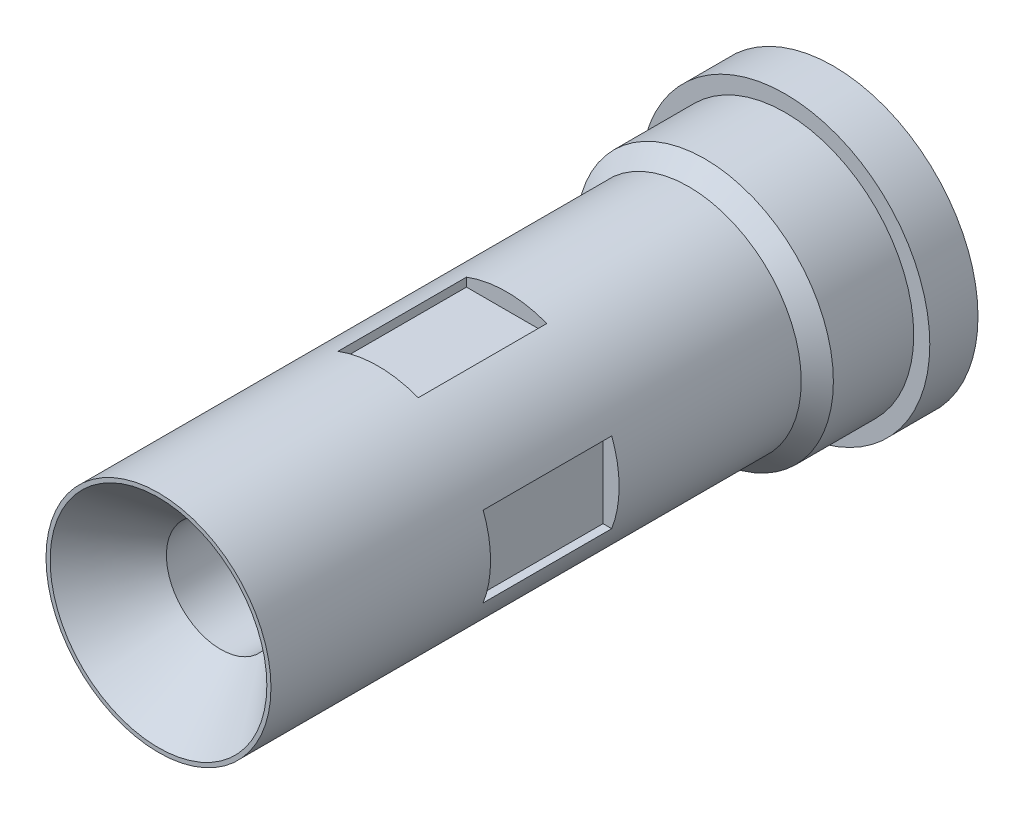
ISO-10303-21;
HEADER;
FILE_DESCRIPTION(('STEP AP214'),'2;1');
FILE_NAME('part.step','',(''),(''),'','','');
FILE_SCHEMA(('AUTOMOTIVE_DESIGN { 1 0 10303 214 1 1 1 1 }'));
ENDSEC;
DATA;
#1=APPLICATION_CONTEXT('core data for automotive mechanical design processes');
#2=APPLICATION_PROTOCOL_DEFINITION('international standard','automotive_design',2000,#1);
#3=PRODUCT_CONTEXT('',#1,'mechanical');
#4=PRODUCT('Part','Part','',(#3));
#5=PRODUCT_RELATED_PRODUCT_CATEGORY('part','',(#4));
#6=PRODUCT_DEFINITION_FORMATION('','',#4);
#7=PRODUCT_DEFINITION_CONTEXT('part definition',#1,'design');
#8=PRODUCT_DEFINITION('design','',#6,#7);
#9=PRODUCT_DEFINITION_SHAPE('','',#8);
#10=(LENGTH_UNIT() NAMED_UNIT(*) SI_UNIT(.MILLI.,.METRE.));
#11=(NAMED_UNIT(*) PLANE_ANGLE_UNIT() SI_UNIT($,.RADIAN.));
#12=(NAMED_UNIT(*) SI_UNIT($,.STERADIAN.) SOLID_ANGLE_UNIT());
#13=UNCERTAINTY_MEASURE_WITH_UNIT(LENGTH_MEASURE(1.E-05),#10,'distance_accuracy_value','');
#14=(GEOMETRIC_REPRESENTATION_CONTEXT(3) GLOBAL_UNCERTAINTY_ASSIGNED_CONTEXT((#13)) GLOBAL_UNIT_ASSIGNED_CONTEXT((#10,
#11,#12)) REPRESENTATION_CONTEXT('',''));
#15=CARTESIAN_POINT('',(0.,0.,0.));
#16=DIRECTION('',(0.,0.,1.));
#17=DIRECTION('',(1.,0.,0.));
#18=AXIS2_PLACEMENT_3D('',#15,#16,#17);
#19=CARTESIAN_POINT('',(0.,0.,9.));
#20=DIRECTION('',(0.,0.,-1.));
#21=DIRECTION('',(-1.,0.,0.));
#22=AXIS2_PLACEMENT_3D('',#19,#20,#21);
#23=CYLINDRICAL_SURFACE('',#22,8.);
#24=CARTESIAN_POINT('',(0.,0.,9.));
#25=DIRECTION('',(0.,0.,-1.));
#26=DIRECTION('',(-1.,0.,0.));
#27=AXIS2_PLACEMENT_3D('',#24,#25,#26);
#28=CIRCLE('',#27,8.);
#29=CARTESIAN_POINT('',(-8.,0.,9.));
#30=VERTEX_POINT('',#29);
#31=EDGE_CURVE('E213',#30,#30,#28,.F.);
#32=ORIENTED_EDGE('',*,*,#31,.F.);
#33=EDGE_LOOP('',(#32));
#34=FACE_BOUND('',#33,.T.);
#35=CARTESIAN_POINT('',(0.,0.,4.));
#36=DIRECTION('',(0.,0.,1.));
#37=DIRECTION('',(1.,0.,0.));
#38=AXIS2_PLACEMENT_3D('',#35,#36,#37);
#39=CIRCLE('',#38,8.);
#40=CARTESIAN_POINT('',(8.,0.,4.));
#41=VERTEX_POINT('',#40);
#42=EDGE_CURVE('E183',#41,#41,#39,.T.);
#43=ORIENTED_EDGE('',*,*,#42,.T.);
#44=EDGE_LOOP('',(#43));
#45=FACE_BOUND('',#44,.T.);
#46=ADVANCED_FACE('F40',(#34,#45),#23,.T.);
#47=CARTESIAN_POINT('',(0.,0.,4.));
#48=DIRECTION('',(0.,0.,-1.));
#49=DIRECTION('',(-1.,0.,0.));
#50=AXIS2_PLACEMENT_3D('',#47,#48,#49);
#51=CYLINDRICAL_SURFACE('',#50,4.);
#52=CARTESIAN_POINT('',(0.,0.,4.));
#53=DIRECTION('',(0.,0.,-1.));
#54=DIRECTION('',(-1.,0.,0.));
#55=AXIS2_PLACEMENT_3D('',#52,#53,#54);
#56=CIRCLE('',#55,4.);
#57=CARTESIAN_POINT('',(-4.,0.,4.));
#58=VERTEX_POINT('',#57);
#59=EDGE_CURVE('E249',#58,#58,#56,.T.);
#60=ORIENTED_EDGE('',*,*,#59,.F.);
#61=EDGE_LOOP('',(#60));
#62=FACE_BOUND('',#61,.T.);
#63=CARTESIAN_POINT('',(0.,0.,1.));
#64=DIRECTION('',(0.,0.,-1.));
#65=DIRECTION('',(-1.,0.,0.));
#66=AXIS2_PLACEMENT_3D('',#63,#64,#65);
#67=CIRCLE('',#66,4.);
#68=CARTESIAN_POINT('',(-4.,0.,1.));
#69=VERTEX_POINT('',#68);
#70=EDGE_CURVE('E248',#69,#69,#67,.T.);
#71=ORIENTED_EDGE('',*,*,#70,.T.);
#72=EDGE_LOOP('',(#71));
#73=FACE_BOUND('',#72,.T.);
#74=ADVANCED_FACE('F336',(#62,#73),#51,.F.);
#75=CARTESIAN_POINT('',(0.,0.,4.));
#76=DIRECTION('',(0.,0.,-1.));
#77=DIRECTION('',(-1.,0.,0.));
#78=AXIS2_PLACEMENT_3D('',#75,#76,#77);
#79=PLANE('',#78);
#80=CARTESIAN_POINT('',(0.,0.,4.));
#81=DIRECTION('',(0.,0.,-1.));
#82=DIRECTION('',(-1.,0.,0.));
#83=AXIS2_PLACEMENT_3D('',#80,#81,#82);
#84=CIRCLE('',#83,3.37819999999999);
#85=CARTESIAN_POINT('',(-3.37819999999999,0.,4.));
#86=VERTEX_POINT('',#85);
#87=EDGE_CURVE('E44',#86,#86,#84,.T.);
#88=ORIENTED_EDGE('',*,*,#87,.F.);
#89=EDGE_LOOP('',(#88));
#90=FACE_BOUND('',#89,.T.);
#91=ORIENTED_EDGE('',*,*,#59,.T.);
#92=EDGE_LOOP('',(#91));
#93=FACE_BOUND('',#92,.T.);
#94=ADVANCED_FACE('F342',(#90,#93),#79,.T.);
#95=CARTESIAN_POINT('',(0.,0.,1.));
#96=DIRECTION('',(0.,0.,-1.));
#97=DIRECTION('',(-1.,0.,0.));
#98=AXIS2_PLACEMENT_3D('',#95,#96,#97);
#99=PLANE('',#98);
#100=ORIENTED_EDGE('',*,*,#70,.F.);
#101=EDGE_LOOP('',(#100));
#102=FACE_BOUND('',#101,.T.);
#103=CARTESIAN_POINT('',(0.,0.,1.));
#104=DIRECTION('',(0.,0.,-1.));
#105=DIRECTION('',(-1.,0.,0.));
#106=AXIS2_PLACEMENT_3D('',#103,#104,#105);
#107=CIRCLE('',#106,9.);
#108=CARTESIAN_POINT('',(-9.,0.,1.));
#109=VERTEX_POINT('',#108);
#110=EDGE_CURVE('E252',#109,#109,#107,.T.);
#111=ORIENTED_EDGE('',*,*,#110,.T.);
#112=EDGE_LOOP('',(#111));
#113=FACE_BOUND('',#112,.T.);
#114=ADVANCED_FACE('F331',(#102,#113),#99,.T.);
#115=CARTESIAN_POINT('',(0.,0.,4.));
#116=DIRECTION('',(0.,0.,-1.));
#117=DIRECTION('',(-1.,0.,0.));
#118=AXIS2_PLACEMENT_3D('',#115,#116,#117);
#119=CYLINDRICAL_SURFACE('',#118,9.);
#120=CARTESIAN_POINT('',(0.,0.,4.));
#121=DIRECTION('',(0.,0.,1.));
#122=DIRECTION('',(1.,0.,0.));
#123=AXIS2_PLACEMENT_3D('',#120,#121,#122);
#124=CIRCLE('',#123,9.);
#125=CARTESIAN_POINT('',(9.,0.,4.));
#126=VERTEX_POINT('',#125);
#127=EDGE_CURVE('E266',#126,#126,#124,.T.);
#128=ORIENTED_EDGE('',*,*,#127,.F.);
#129=EDGE_LOOP('',(#128));
#130=FACE_BOUND('',#129,.T.);
#131=ORIENTED_EDGE('',*,*,#110,.F.);
#132=EDGE_LOOP('',(#131));
#133=FACE_BOUND('',#132,.T.);
#134=ADVANCED_FACE('F42',(#130,#133),#119,.T.);
#135=CARTESIAN_POINT('',(0.,0.,4.));
#136=DIRECTION('',(0.,0.,1.));
#137=DIRECTION('',(1.,0.,0.));
#138=AXIS2_PLACEMENT_3D('',#135,#136,#137);
#139=PLANE('',#138);
#140=ORIENTED_EDGE('',*,*,#42,.F.);
#141=EDGE_LOOP('',(#140));
#142=FACE_BOUND('',#141,.T.);
#143=ORIENTED_EDGE('',*,*,#127,.T.);
#144=EDGE_LOOP('',(#143));
#145=FACE_BOUND('',#144,.T.);
#146=ADVANCED_FACE('F321',(#142,#145),#139,.T.);
#147=CARTESIAN_POINT('',(0.,0.,10.));
#148=DIRECTION('',(0.,0.,-1.));
#149=DIRECTION('',(-1.,0.,0.));
#150=AXIS2_PLACEMENT_3D('',#147,#148,#149);
#151=CONICAL_SURFACE('',#150,7.,0.785398163397449);
#152=ORIENTED_EDGE('',*,*,#31,.T.);
#153=EDGE_LOOP('',(#152));
#154=FACE_BOUND('',#153,.T.);
#155=CARTESIAN_POINT('',(0.,0.,10.));
#156=DIRECTION('',(0.,0.,1.));
#157=DIRECTION('',(1.,0.,0.));
#158=AXIS2_PLACEMENT_3D('',#155,#156,#157);
#159=CIRCLE('',#158,7.);
#160=CARTESIAN_POINT('',(7.,0.,10.));
#161=VERTEX_POINT('',#160);
#162=EDGE_CURVE('E304',#161,#161,#159,.T.);
#163=ORIENTED_EDGE('',*,*,#162,.F.);
#164=EDGE_LOOP('',(#163));
#165=FACE_BOUND('',#164,.T.);
#166=ADVANCED_FACE('F323',(#154,#165),#151,.T.);
#167=CARTESIAN_POINT('',(0.,-6.,0.));
#168=DIRECTION('',(0.,1.,0.));
#169=DIRECTION('',(0.,0.,1.));
#170=AXIS2_PLACEMENT_3D('',#167,#168,#169);
#171=PLANE('',#170);
#172=DIRECTION('',(1.,0.,0.));
#173=VECTOR('',#172,1.);
#174=CARTESIAN_POINT('',(-2.50000000000001,-5.99999999999999,21.3337059705794));
#175=LINE('',#174,#173);
#176=CARTESIAN_POINT('',(-2.50000000000001,-5.99999999999999,21.3337059705794));
#177=VERTEX_POINT('',#176);
#178=CARTESIAN_POINT('',(2.49999999999999,-6.00000000000001,21.3337059705794));
#179=VERTEX_POINT('',#178);
#180=EDGE_CURVE('E159',#177,#179,#175,.T.);
#181=ORIENTED_EDGE('',*,*,#180,.T.);
#182=DIRECTION('',(0.,0.,1.));
#183=VECTOR('',#182,1.);
#184=CARTESIAN_POINT('',(2.49999999999999,-6.00000000000001,29.3337059705794));
#185=LINE('',#184,#183);
#186=CARTESIAN_POINT('',(2.49999999999999,-6.00000000000001,29.3337059705794));
#187=VERTEX_POINT('',#186);
#188=EDGE_CURVE('E167',#179,#187,#185,.T.);
#189=ORIENTED_EDGE('',*,*,#188,.T.);
#190=DIRECTION('',(-1.,0.,0.));
#191=VECTOR('',#190,1.);
#192=CARTESIAN_POINT('',(-2.50000000000001,-5.99999999999999,29.3337059705794));
#193=LINE('',#192,#191);
#194=CARTESIAN_POINT('',(-2.50000000000001,-5.99999999999999,29.3337059705794));
#195=VERTEX_POINT('',#194);
#196=EDGE_CURVE('E173',#187,#195,#193,.T.);
#197=ORIENTED_EDGE('',*,*,#196,.T.);
#198=DIRECTION('',(0.,0.,-1.));
#199=VECTOR('',#198,1.);
#200=CARTESIAN_POINT('',(-2.50000000000001,-5.99999999999999,29.3337059705794));
#201=LINE('',#200,#199);
#202=EDGE_CURVE('E177',#195,#177,#201,.T.);
#203=ORIENTED_EDGE('',*,*,#202,.T.);
#204=EDGE_LOOP('',(#181,#189,#197,#203));
#205=FACE_BOUND('',#204,.T.);
#206=ADVANCED_FACE('F176',(#205),#171,.F.);
#207=CARTESIAN_POINT('',(0.,6.,0.));
#208=DIRECTION('',(0.,-1.,0.));
#209=DIRECTION('',(0.,0.,1.));
#210=AXIS2_PLACEMENT_3D('',#207,#208,#209);
#211=PLANE('',#210);
#212=DIRECTION('',(-1.,0.,0.));
#213=VECTOR('',#212,1.);
#214=CARTESIAN_POINT('',(2.50000000000004,5.99999999999998,21.3337059705794));
#215=LINE('',#214,#213);
#216=CARTESIAN_POINT('',(2.50000000000004,5.99999999999998,21.3337059705794));
#217=VERTEX_POINT('',#216);
#218=CARTESIAN_POINT('',(-2.49999999999996,6.00000000000002,21.3337059705794));
#219=VERTEX_POINT('',#218);
#220=EDGE_CURVE('E209',#217,#219,#215,.T.);
#221=ORIENTED_EDGE('',*,*,#220,.T.);
#222=DIRECTION('',(0.,0.,1.));
#223=VECTOR('',#222,1.);
#224=CARTESIAN_POINT('',(-2.49999999999996,6.00000000000002,29.3337059705794));
#225=LINE('',#224,#223);
#226=CARTESIAN_POINT('',(-2.49999999999996,6.00000000000002,29.3337059705794));
#227=VERTEX_POINT('',#226);
#228=EDGE_CURVE('E212',#219,#227,#225,.T.);
#229=ORIENTED_EDGE('',*,*,#228,.T.);
#230=DIRECTION('',(1.,0.,0.));
#231=VECTOR('',#230,1.);
#232=CARTESIAN_POINT('',(2.50000000000004,5.99999999999998,29.3337059705794));
#233=LINE('',#232,#231);
#234=CARTESIAN_POINT('',(2.50000000000004,5.99999999999998,29.3337059705794));
#235=VERTEX_POINT('',#234);
#236=EDGE_CURVE('E216',#227,#235,#233,.T.);
#237=ORIENTED_EDGE('',*,*,#236,.T.);
#238=DIRECTION('',(0.,0.,-1.));
#239=VECTOR('',#238,1.);
#240=CARTESIAN_POINT('',(2.50000000000004,5.99999999999998,29.3337059705794));
#241=LINE('',#240,#239);
#242=EDGE_CURVE('E219',#235,#217,#241,.T.);
#243=ORIENTED_EDGE('',*,*,#242,.T.);
#244=EDGE_LOOP('',(#221,#229,#237,#243));
#245=FACE_BOUND('',#244,.T.);
#246=ADVANCED_FACE('F351',(#245),#211,.F.);
#247=CARTESIAN_POINT('',(6.,0.,0.));
#248=DIRECTION('',(-1.,0.,0.));
#249=DIRECTION('',(0.,0.,1.));
#250=AXIS2_PLACEMENT_3D('',#247,#248,#249);
#251=PLANE('',#250);
#252=DIRECTION('',(0.,1.,0.));
#253=VECTOR('',#252,1.);
#254=CARTESIAN_POINT('',(6.,-2.5,21.3337059705794));
#255=LINE('',#254,#253);
#256=CARTESIAN_POINT('',(6.,-2.5,21.3337059705794));
#257=VERTEX_POINT('',#256);
#258=CARTESIAN_POINT('',(6.,2.5,21.3337059705794));
#259=VERTEX_POINT('',#258);
#260=EDGE_CURVE('E163',#257,#259,#255,.T.);
#261=ORIENTED_EDGE('',*,*,#260,.T.);
#262=DIRECTION('',(0.,0.,1.));
#263=VECTOR('',#262,1.);
#264=CARTESIAN_POINT('',(6.,2.5,29.3337059705794));
#265=LINE('',#264,#263);
#266=CARTESIAN_POINT('',(6.,2.5,29.3337059705794));
#267=VERTEX_POINT('',#266);
#268=EDGE_CURVE('E231',#259,#267,#265,.T.);
#269=ORIENTED_EDGE('',*,*,#268,.T.);
#270=DIRECTION('',(0.,-1.,0.));
#271=VECTOR('',#270,1.);
#272=CARTESIAN_POINT('',(6.,-2.5,29.3337059705794));
#273=LINE('',#272,#271);
#274=CARTESIAN_POINT('',(6.,-2.5,29.3337059705794));
#275=VERTEX_POINT('',#274);
#276=EDGE_CURVE('E234',#267,#275,#273,.T.);
#277=ORIENTED_EDGE('',*,*,#276,.T.);
#278=DIRECTION('',(0.,0.,-1.));
#279=VECTOR('',#278,1.);
#280=CARTESIAN_POINT('',(6.,-2.5,29.3337059705794));
#281=LINE('',#280,#279);
#282=EDGE_CURVE('E237',#275,#257,#281,.T.);
#283=ORIENTED_EDGE('',*,*,#282,.T.);
#284=EDGE_LOOP('',(#261,#269,#277,#283));
#285=FACE_BOUND('',#284,.T.);
#286=ADVANCED_FACE('F367',(#285),#251,.F.);
#287=CARTESIAN_POINT('',(-6.,0.,0.));
#288=DIRECTION('',(1.,0.,0.));
#289=DIRECTION('',(0.,0.,1.));
#290=AXIS2_PLACEMENT_3D('',#287,#288,#289);
#291=PLANE('',#290);
#292=DIRECTION('',(0.,-1.,0.));
#293=VECTOR('',#292,1.);
#294=CARTESIAN_POINT('',(-5.99999999999999,2.50000000000003,21.3337059705794));
#295=LINE('',#294,#293);
#296=CARTESIAN_POINT('',(-5.99999999999999,2.50000000000003,21.3337059705794));
#297=VERTEX_POINT('',#296);
#298=CARTESIAN_POINT('',(-6.00000000000001,-2.49999999999997,21.3337059705794));
#299=VERTEX_POINT('',#298);
#300=EDGE_CURVE('E192',#297,#299,#295,.T.);
#301=ORIENTED_EDGE('',*,*,#300,.T.);
#302=DIRECTION('',(0.,0.,1.));
#303=VECTOR('',#302,1.);
#304=CARTESIAN_POINT('',(-6.00000000000001,-2.49999999999997,29.3337059705794));
#305=LINE('',#304,#303);
#306=CARTESIAN_POINT('',(-6.00000000000001,-2.49999999999997,29.3337059705794));
#307=VERTEX_POINT('',#306);
#308=EDGE_CURVE('E195',#299,#307,#305,.T.);
#309=ORIENTED_EDGE('',*,*,#308,.T.);
#310=DIRECTION('',(0.,1.,0.));
#311=VECTOR('',#310,1.);
#312=CARTESIAN_POINT('',(-5.99999999999999,2.50000000000003,29.3337059705794));
#313=LINE('',#312,#311);
#314=CARTESIAN_POINT('',(-5.99999999999999,2.50000000000003,29.3337059705794));
#315=VERTEX_POINT('',#314);
#316=EDGE_CURVE('E199',#307,#315,#313,.T.);
#317=ORIENTED_EDGE('',*,*,#316,.T.);
#318=DIRECTION('',(0.,0.,-1.));
#319=VECTOR('',#318,1.);
#320=CARTESIAN_POINT('',(-5.99999999999999,2.50000000000003,29.3337059705794));
#321=LINE('',#320,#319);
#322=EDGE_CURVE('E202',#315,#297,#321,.T.);
#323=ORIENTED_EDGE('',*,*,#322,.T.);
#324=EDGE_LOOP('',(#301,#309,#317,#323));
#325=FACE_BOUND('',#324,.T.);
#326=ADVANCED_FACE('F361',(#325),#291,.F.);
#327=CARTESIAN_POINT('',(2.49999999999998,-9.00000000000001,29.3337059705794));
#328=DIRECTION('',(-1.,0.,0.));
#329=DIRECTION('',(0.,-1.,0.));
#330=AXIS2_PLACEMENT_3D('',#327,#328,#329);
#331=PLANE('',#330);
#332=DIRECTION('',(0.,0.,-1.));
#333=VECTOR('',#332,1.);
#334=CARTESIAN_POINT('',(2.49999999999998,-6.53834841531102,43.));
#335=LINE('',#334,#333);
#336=CARTESIAN_POINT('',(2.49999999999998,-6.53834841531102,21.3337059705794));
#337=VERTEX_POINT('',#336);
#338=CARTESIAN_POINT('',(2.49999999999998,-6.53834841531102,29.3337059705794));
#339=VERTEX_POINT('',#338);
#340=EDGE_CURVE('E49',#337,#339,#335,.F.);
#341=ORIENTED_EDGE('',*,*,#340,.T.);
#342=DIRECTION('',(0.,1.,0.));
#343=VECTOR('',#342,1.);
#344=CARTESIAN_POINT('',(2.49999999999998,-9.00000000000001,29.3337059705794));
#345=LINE('',#344,#343);
#346=EDGE_CURVE('E164',#339,#187,#345,.T.);
#347=ORIENTED_EDGE('',*,*,#346,.T.);
#348=ORIENTED_EDGE('',*,*,#188,.F.);
#349=DIRECTION('',(0.,1.,0.));
#350=VECTOR('',#349,1.);
#351=CARTESIAN_POINT('',(2.49999999999998,-9.00000000000001,21.3337059705794));
#352=LINE('',#351,#350);
#353=EDGE_CURVE('E154',#337,#179,#352,.T.);
#354=ORIENTED_EDGE('',*,*,#353,.F.);
#355=EDGE_LOOP('',(#341,#347,#348,#354));
#356=FACE_BOUND('',#355,.T.);
#357=ADVANCED_FACE('F168',(#356),#331,.T.);
#358=CARTESIAN_POINT('',(-2.50000000000002,-8.99999999999999,29.3337059705794));
#359=DIRECTION('',(0.,0.,-1.));
#360=DIRECTION('',(-1.,0.,0.));
#361=AXIS2_PLACEMENT_3D('',#358,#359,#360);
#362=PLANE('',#361);
#363=CARTESIAN_POINT('',(0.,0.,29.3337059705794));
#364=DIRECTION('',(0.,0.,-1.));
#365=DIRECTION('',(-1.,0.,0.));
#366=AXIS2_PLACEMENT_3D('',#363,#364,#365);
#367=CIRCLE('',#366,7.);
#368=CARTESIAN_POINT('',(-2.50000000000002,-6.538348415311,29.3337059705794));
#369=VERTEX_POINT('',#368);
#370=EDGE_CURVE('E297',#339,#369,#367,.T.);
#371=ORIENTED_EDGE('',*,*,#370,.T.);
#372=DIRECTION('',(0.,1.,0.));
#373=VECTOR('',#372,1.);
#374=CARTESIAN_POINT('',(-2.50000000000002,-8.99999999999999,29.3337059705794));
#375=LINE('',#374,#373);
#376=EDGE_CURVE('E57',#369,#195,#375,.T.);
#377=ORIENTED_EDGE('',*,*,#376,.T.);
#378=ORIENTED_EDGE('',*,*,#196,.F.);
#379=ORIENTED_EDGE('',*,*,#346,.F.);
#380=EDGE_LOOP('',(#371,#377,#378,#379));
#381=FACE_BOUND('',#380,.T.);
#382=ADVANCED_FACE('F355',(#381),#362,.T.);
#383=CARTESIAN_POINT('',(-2.50000000000002,-8.99999999999999,29.3337059705794));
#384=DIRECTION('',(1.,0.,0.));
#385=DIRECTION('',(0.,1.,0.));
#386=AXIS2_PLACEMENT_3D('',#383,#384,#385);
#387=PLANE('',#386);
#388=DIRECTION('',(0.,0.,-1.));
#389=VECTOR('',#388,1.);
#390=CARTESIAN_POINT('',(-2.50000000000002,-6.538348415311,43.));
#391=LINE('',#390,#389);
#392=CARTESIAN_POINT('',(-2.50000000000002,-6.538348415311,21.3337059705794));
#393=VERTEX_POINT('',#392);
#394=EDGE_CURVE('E295',#369,#393,#391,.T.);
#395=ORIENTED_EDGE('',*,*,#394,.T.);
#396=DIRECTION('',(0.,1.,0.));
#397=VECTOR('',#396,1.);
#398=CARTESIAN_POINT('',(-2.50000000000002,-8.99999999999999,21.3337059705794));
#399=LINE('',#398,#397);
#400=EDGE_CURVE('E188',#393,#177,#399,.T.);
#401=ORIENTED_EDGE('',*,*,#400,.T.);
#402=ORIENTED_EDGE('',*,*,#202,.F.);
#403=ORIENTED_EDGE('',*,*,#376,.F.);
#404=EDGE_LOOP('',(#395,#401,#402,#403));
#405=FACE_BOUND('',#404,.T.);
#406=ADVANCED_FACE('F352',(#405),#387,.T.);
#407=CARTESIAN_POINT('',(-2.50000000000002,-8.99999999999999,21.3337059705794));
#408=DIRECTION('',(0.,0.,1.));
#409=DIRECTION('',(1.,0.,0.));
#410=AXIS2_PLACEMENT_3D('',#407,#408,#409);
#411=PLANE('',#410);
#412=CARTESIAN_POINT('',(0.,0.,21.3337059705794));
#413=DIRECTION('',(0.,0.,1.));
#414=DIRECTION('',(1.,0.,0.));
#415=AXIS2_PLACEMENT_3D('',#412,#413,#414);
#416=CIRCLE('',#415,7.);
#417=EDGE_CURVE('E12',#393,#337,#416,.T.);
#418=ORIENTED_EDGE('',*,*,#417,.T.);
#419=ORIENTED_EDGE('',*,*,#353,.T.);
#420=ORIENTED_EDGE('',*,*,#180,.F.);
#421=ORIENTED_EDGE('',*,*,#400,.F.);
#422=EDGE_LOOP('',(#418,#419,#420,#421));
#423=FACE_BOUND('',#422,.T.);
#424=ADVANCED_FACE('F156',(#423),#411,.T.);
#425=CARTESIAN_POINT('',(-2.49999999999994,9.00000000000002,29.3337059705794));
#426=DIRECTION('',(1.,0.,0.));
#427=DIRECTION('',(0.,1.,0.));
#428=AXIS2_PLACEMENT_3D('',#425,#426,#427);
#429=PLANE('',#428);
#430=DIRECTION('',(0.,0.,-1.));
#431=VECTOR('',#430,1.);
#432=CARTESIAN_POINT('',(-2.49999999999995,6.53834841531103,43.));
#433=LINE('',#432,#431);
#434=CARTESIAN_POINT('',(-2.49999999999995,6.53834841531103,21.3337059705794));
#435=VERTEX_POINT('',#434);
#436=CARTESIAN_POINT('',(-2.49999999999995,6.53834841531103,29.3337059705794));
#437=VERTEX_POINT('',#436);
#438=EDGE_CURVE('E283',#435,#437,#433,.F.);
#439=ORIENTED_EDGE('',*,*,#438,.T.);
#440=DIRECTION('',(0.,-1.,0.));
#441=VECTOR('',#440,1.);
#442=CARTESIAN_POINT('',(-2.49999999999994,9.00000000000002,29.3337059705794));
#443=LINE('',#442,#441);
#444=EDGE_CURVE('E226',#437,#227,#443,.T.);
#445=ORIENTED_EDGE('',*,*,#444,.T.);
#446=ORIENTED_EDGE('',*,*,#228,.F.);
#447=DIRECTION('',(0.,-1.,0.));
#448=VECTOR('',#447,1.);
#449=CARTESIAN_POINT('',(-2.49999999999994,9.00000000000002,21.3337059705794));
#450=LINE('',#449,#448);
#451=EDGE_CURVE('E196',#435,#219,#450,.T.);
#452=ORIENTED_EDGE('',*,*,#451,.F.);
#453=EDGE_LOOP('',(#439,#445,#446,#452));
#454=FACE_BOUND('',#453,.T.);
#455=ADVANCED_FACE('F364',(#454),#429,.T.);
#456=CARTESIAN_POINT('',(2.50000000000006,8.99999999999998,29.3337059705794));
#457=DIRECTION('',(0.,0.,-1.));
#458=DIRECTION('',(-1.,0.,0.));
#459=AXIS2_PLACEMENT_3D('',#456,#457,#458);
#460=PLANE('',#459);
#461=CARTESIAN_POINT('',(0.,0.,29.3337059705794));
#462=DIRECTION('',(0.,0.,-1.));
#463=DIRECTION('',(-1.,0.,0.));
#464=AXIS2_PLACEMENT_3D('',#461,#462,#463);
#465=CIRCLE('',#464,7.);
#466=CARTESIAN_POINT('',(2.50000000000005,6.53834841531099,29.3337059705794));
#467=VERTEX_POINT('',#466);
#468=EDGE_CURVE('E280',#437,#467,#465,.T.);
#469=ORIENTED_EDGE('',*,*,#468,.T.);
#470=DIRECTION('',(0.,-1.,0.));
#471=VECTOR('',#470,1.);
#472=CARTESIAN_POINT('',(2.50000000000006,8.99999999999998,29.3337059705794));
#473=LINE('',#472,#471);
#474=EDGE_CURVE('E224',#467,#235,#473,.T.);
#475=ORIENTED_EDGE('',*,*,#474,.T.);
#476=ORIENTED_EDGE('',*,*,#236,.F.);
#477=ORIENTED_EDGE('',*,*,#444,.F.);
#478=EDGE_LOOP('',(#469,#475,#476,#477));
#479=FACE_BOUND('',#478,.T.);
#480=ADVANCED_FACE('F391',(#479),#460,.T.);
#481=CARTESIAN_POINT('',(2.50000000000006,8.99999999999998,29.3337059705794));
#482=DIRECTION('',(-1.,0.,0.));
#483=DIRECTION('',(0.,-1.,0.));
#484=AXIS2_PLACEMENT_3D('',#481,#482,#483);
#485=PLANE('',#484);
#486=DIRECTION('',(0.,0.,-1.));
#487=VECTOR('',#486,1.);
#488=CARTESIAN_POINT('',(2.50000000000005,6.53834841531099,43.));
#489=LINE('',#488,#487);
#490=CARTESIAN_POINT('',(2.50000000000005,6.53834841531099,21.3337059705794));
#491=VERTEX_POINT('',#490);
#492=EDGE_CURVE('E278',#467,#491,#489,.T.);
#493=ORIENTED_EDGE('',*,*,#492,.T.);
#494=DIRECTION('',(0.,-1.,0.));
#495=VECTOR('',#494,1.);
#496=CARTESIAN_POINT('',(2.50000000000006,8.99999999999998,21.3337059705794));
#497=LINE('',#496,#495);
#498=EDGE_CURVE('E222',#491,#217,#497,.T.);
#499=ORIENTED_EDGE('',*,*,#498,.T.);
#500=ORIENTED_EDGE('',*,*,#242,.F.);
#501=ORIENTED_EDGE('',*,*,#474,.F.);
#502=EDGE_LOOP('',(#493,#499,#500,#501));
#503=FACE_BOUND('',#502,.T.);
#504=ADVANCED_FACE('F387',(#503),#485,.T.);
#505=CARTESIAN_POINT('',(2.50000000000006,8.99999999999998,21.3337059705794));
#506=DIRECTION('',(0.,0.,1.));
#507=DIRECTION('',(1.,0.,0.));
#508=AXIS2_PLACEMENT_3D('',#505,#506,#507);
#509=PLANE('',#508);
#510=CARTESIAN_POINT('',(0.,0.,21.3337059705794));
#511=DIRECTION('',(0.,0.,1.));
#512=DIRECTION('',(1.,0.,0.));
#513=AXIS2_PLACEMENT_3D('',#510,#511,#512);
#514=CIRCLE('',#513,7.);
#515=EDGE_CURVE('E285',#491,#435,#514,.T.);
#516=ORIENTED_EDGE('',*,*,#515,.T.);
#517=ORIENTED_EDGE('',*,*,#451,.T.);
#518=ORIENTED_EDGE('',*,*,#220,.F.);
#519=ORIENTED_EDGE('',*,*,#498,.F.);
#520=EDGE_LOOP('',(#516,#517,#518,#519));
#521=FACE_BOUND('',#520,.T.);
#522=ADVANCED_FACE('F390',(#521),#509,.T.);
#523=CARTESIAN_POINT('',(0.,0.,43.));
#524=DIRECTION('',(0.,0.,1.));
#525=DIRECTION('',(1.,0.,0.));
#526=AXIS2_PLACEMENT_3D('',#523,#524,#525);
#527=CONICAL_SURFACE('',#526,6.7437,0.715584993317675);
#528=CARTESIAN_POINT('',(0.,0.,39.1284351254977));
#529=DIRECTION('',(0.,0.,1.));
#530=DIRECTION('',(1.,0.,0.));
#531=AXIS2_PLACEMENT_3D('',#528,#529,#530);
#532=CIRCLE('',#531,3.37819999999999);
#533=CARTESIAN_POINT('',(3.37819999999999,0.,39.1284351254977));
#534=VERTEX_POINT('',#533);
#535=EDGE_CURVE('E260',#534,#534,#532,.T.);
#536=ORIENTED_EDGE('',*,*,#535,.F.);
#537=EDGE_LOOP('',(#536));
#538=FACE_BOUND('',#537,.T.);
#539=CARTESIAN_POINT('',(0.,0.,43.));
#540=DIRECTION('',(0.,0.,1.));
#541=DIRECTION('',(1.,0.,0.));
#542=AXIS2_PLACEMENT_3D('',#539,#540,#541);
#543=CIRCLE('',#542,6.7437);
#544=CARTESIAN_POINT('',(6.7437,0.,43.));
#545=VERTEX_POINT('',#544);
#546=EDGE_CURVE('E257',#545,#545,#543,.T.);
#547=ORIENTED_EDGE('',*,*,#546,.T.);
#548=EDGE_LOOP('',(#547));
#549=FACE_BOUND('',#548,.T.);
#550=ADVANCED_FACE('F401',(#538,#549),#527,.F.);
#551=CARTESIAN_POINT('',(0.,0.,43.));
#552=DIRECTION('',(0.,0.,1.));
#553=DIRECTION('',(1.,0.,0.));
#554=AXIS2_PLACEMENT_3D('',#551,#552,#553);
#555=CYLINDRICAL_SURFACE('',#554,3.37819999999999);
#556=ORIENTED_EDGE('',*,*,#535,.T.);
#557=EDGE_LOOP('',(#556));
#558=FACE_BOUND('',#557,.T.);
#559=ORIENTED_EDGE('',*,*,#87,.T.);
#560=EDGE_LOOP('',(#559));
#561=FACE_BOUND('',#560,.T.);
#562=ADVANCED_FACE('F428',(#558,#561),#555,.F.);
#563=CARTESIAN_POINT('',(0.,0.,43.));
#564=DIRECTION('',(0.,0.,1.));
#565=DIRECTION('',(1.,0.,0.));
#566=AXIS2_PLACEMENT_3D('',#563,#564,#565);
#567=PLANE('',#566);
#568=ORIENTED_EDGE('',*,*,#546,.F.);
#569=EDGE_LOOP('',(#568));
#570=FACE_BOUND('',#569,.T.);
#571=CARTESIAN_POINT('',(0.,0.,43.));
#572=DIRECTION('',(0.,0.,1.));
#573=DIRECTION('',(1.,0.,0.));
#574=AXIS2_PLACEMENT_3D('',#571,#572,#573);
#575=CIRCLE('',#574,7.);
#576=CARTESIAN_POINT('',(7.,0.,43.));
#577=VERTEX_POINT('',#576);
#578=EDGE_CURVE('E263',#577,#577,#575,.T.);
#579=ORIENTED_EDGE('',*,*,#578,.T.);
#580=EDGE_LOOP('',(#579));
#581=FACE_BOUND('',#580,.T.);
#582=ADVANCED_FACE('F319',(#570,#581),#567,.T.);
#583=CARTESIAN_POINT('',(9.,2.5,29.3337059705794));
#584=DIRECTION('',(0.,-1.,0.));
#585=DIRECTION('',(0.,0.,-1.));
#586=AXIS2_PLACEMENT_3D('',#583,#584,#585);
#587=PLANE('',#586);
#588=DIRECTION('',(0.,0.,-1.));
#589=VECTOR('',#588,1.);
#590=CARTESIAN_POINT('',(6.53834841531101,2.5,43.));
#591=LINE('',#590,#589);
#592=CARTESIAN_POINT('',(6.53834841531101,2.5,21.3337059705794));
#593=VERTEX_POINT('',#592);
#594=CARTESIAN_POINT('',(6.53834841531101,2.5,29.3337059705794));
#595=VERTEX_POINT('',#594);
#596=EDGE_CURVE('E274',#593,#595,#591,.F.);
#597=ORIENTED_EDGE('',*,*,#596,.T.);
#598=DIRECTION('',(-1.,0.,0.));
#599=VECTOR('',#598,1.);
#600=CARTESIAN_POINT('',(9.,2.5,29.3337059705794));
#601=LINE('',#600,#599);
#602=EDGE_CURVE('E244',#595,#267,#601,.T.);
#603=ORIENTED_EDGE('',*,*,#602,.T.);
#604=ORIENTED_EDGE('',*,*,#268,.F.);
#605=DIRECTION('',(-1.,0.,0.));
#606=VECTOR('',#605,1.);
#607=CARTESIAN_POINT('',(9.,2.5,21.3337059705794));
#608=LINE('',#607,#606);
#609=EDGE_CURVE('E246',#593,#259,#608,.T.);
#610=ORIENTED_EDGE('',*,*,#609,.F.);
#611=EDGE_LOOP('',(#597,#603,#604,#610));
#612=FACE_BOUND('',#611,.T.);
#613=ADVANCED_FACE('F413',(#612),#587,.T.);
#614=CARTESIAN_POINT('',(9.,-2.5,29.3337059705794));
#615=DIRECTION('',(0.,0.,-1.));
#616=DIRECTION('',(-1.,0.,0.));
#617=AXIS2_PLACEMENT_3D('',#614,#615,#616);
#618=PLANE('',#617);
#619=CARTESIAN_POINT('',(0.,0.,29.3337059705794));
#620=DIRECTION('',(0.,0.,-1.));
#621=DIRECTION('',(-1.,0.,0.));
#622=AXIS2_PLACEMENT_3D('',#619,#620,#621);
#623=CIRCLE('',#622,7.);
#624=CARTESIAN_POINT('',(6.53834841531101,-2.5,29.3337059705794));
#625=VERTEX_POINT('',#624);
#626=EDGE_CURVE('E271',#595,#625,#623,.T.);
#627=ORIENTED_EDGE('',*,*,#626,.T.);
#628=DIRECTION('',(-1.,0.,0.));
#629=VECTOR('',#628,1.);
#630=CARTESIAN_POINT('',(9.,-2.5,29.3337059705794));
#631=LINE('',#630,#629);
#632=EDGE_CURVE('E242',#625,#275,#631,.T.);
#633=ORIENTED_EDGE('',*,*,#632,.T.);
#634=ORIENTED_EDGE('',*,*,#276,.F.);
#635=ORIENTED_EDGE('',*,*,#602,.F.);
#636=EDGE_LOOP('',(#627,#633,#634,#635));
#637=FACE_BOUND('',#636,.T.);
#638=ADVANCED_FACE('F409',(#637),#618,.T.);
#639=CARTESIAN_POINT('',(9.,-2.5,29.3337059705794));
#640=DIRECTION('',(0.,1.,0.));
#641=DIRECTION('',(0.,0.,1.));
#642=AXIS2_PLACEMENT_3D('',#639,#640,#641);
#643=PLANE('',#642);
#644=DIRECTION('',(0.,0.,-1.));
#645=VECTOR('',#644,1.);
#646=CARTESIAN_POINT('',(6.53834841531101,-2.5,43.));
#647=LINE('',#646,#645);
#648=CARTESIAN_POINT('',(6.53834841531101,-2.5,21.3337059705794));
#649=VERTEX_POINT('',#648);
#650=EDGE_CURVE('E269',#625,#649,#647,.T.);
#651=ORIENTED_EDGE('',*,*,#650,.T.);
#652=DIRECTION('',(-1.,0.,0.));
#653=VECTOR('',#652,1.);
#654=CARTESIAN_POINT('',(9.,-2.5,21.3337059705794));
#655=LINE('',#654,#653);
#656=EDGE_CURVE('E240',#649,#257,#655,.T.);
#657=ORIENTED_EDGE('',*,*,#656,.T.);
#658=ORIENTED_EDGE('',*,*,#282,.F.);
#659=ORIENTED_EDGE('',*,*,#632,.F.);
#660=EDGE_LOOP('',(#651,#657,#658,#659));
#661=FACE_BOUND('',#660,.T.);
#662=ADVANCED_FACE('F406',(#661),#643,.T.);
#663=CARTESIAN_POINT('',(9.,-2.5,21.3337059705794));
#664=DIRECTION('',(0.,0.,1.));
#665=DIRECTION('',(1.,0.,0.));
#666=AXIS2_PLACEMENT_3D('',#663,#664,#665);
#667=PLANE('',#666);
#668=CARTESIAN_POINT('',(0.,0.,21.3337059705794));
#669=DIRECTION('',(0.,0.,1.));
#670=DIRECTION('',(1.,0.,0.));
#671=AXIS2_PLACEMENT_3D('',#668,#669,#670);
#672=CIRCLE('',#671,7.);
#673=EDGE_CURVE('E276',#649,#593,#672,.T.);
#674=ORIENTED_EDGE('',*,*,#673,.T.);
#675=ORIENTED_EDGE('',*,*,#609,.T.);
#676=ORIENTED_EDGE('',*,*,#260,.F.);
#677=ORIENTED_EDGE('',*,*,#656,.F.);
#678=EDGE_LOOP('',(#674,#675,#676,#677));
#679=FACE_BOUND('',#678,.T.);
#680=ADVANCED_FACE('F379',(#679),#667,.T.);
#681=CARTESIAN_POINT('',(-9.00000000000001,-2.49999999999996,29.3337059705794));
#682=DIRECTION('',(0.,1.,0.));
#683=DIRECTION('',(-1.,0.,0.));
#684=AXIS2_PLACEMENT_3D('',#681,#682,#683);
#685=PLANE('',#684);
#686=DIRECTION('',(0.,0.,-1.));
#687=VECTOR('',#686,1.);
#688=CARTESIAN_POINT('',(-6.53834841531102,-2.49999999999997,43.));
#689=LINE('',#688,#687);
#690=CARTESIAN_POINT('',(-6.53834841531102,-2.49999999999997,21.3337059705794));
#691=VERTEX_POINT('',#690);
#692=CARTESIAN_POINT('',(-6.53834841531102,-2.49999999999997,29.3337059705794));
#693=VERTEX_POINT('',#692);
#694=EDGE_CURVE('E291',#691,#693,#689,.F.);
#695=ORIENTED_EDGE('',*,*,#694,.T.);
#696=DIRECTION('',(1.,0.,0.));
#697=VECTOR('',#696,1.);
#698=CARTESIAN_POINT('',(-9.00000000000001,-2.49999999999996,29.3337059705794));
#699=LINE('',#698,#697);
#700=EDGE_CURVE('E180',#693,#307,#699,.T.);
#701=ORIENTED_EDGE('',*,*,#700,.T.);
#702=ORIENTED_EDGE('',*,*,#308,.F.);
#703=DIRECTION('',(1.,0.,0.));
#704=VECTOR('',#703,1.);
#705=CARTESIAN_POINT('',(-9.00000000000001,-2.49999999999996,21.3337059705794));
#706=LINE('',#705,#704);
#707=EDGE_CURVE('E178',#691,#299,#706,.T.);
#708=ORIENTED_EDGE('',*,*,#707,.F.);
#709=EDGE_LOOP('',(#695,#701,#702,#708));
#710=FACE_BOUND('',#709,.T.);
#711=ADVANCED_FACE('F375',(#710),#685,.T.);
#712=CARTESIAN_POINT('',(-8.99999999999999,2.50000000000004,29.3337059705794));
#713=DIRECTION('',(0.,0.,-1.));
#714=DIRECTION('',(-1.,0.,0.));
#715=AXIS2_PLACEMENT_3D('',#712,#713,#714);
#716=PLANE('',#715);
#717=CARTESIAN_POINT('',(0.,0.,29.3337059705794));
#718=DIRECTION('',(0.,0.,-1.));
#719=DIRECTION('',(-1.,0.,0.));
#720=AXIS2_PLACEMENT_3D('',#717,#718,#719);
#721=CIRCLE('',#720,7.);
#722=CARTESIAN_POINT('',(-6.538348415311,2.50000000000003,29.3337059705794));
#723=VERTEX_POINT('',#722);
#724=EDGE_CURVE('E289',#693,#723,#721,.T.);
#725=ORIENTED_EDGE('',*,*,#724,.T.);
#726=DIRECTION('',(1.,0.,0.));
#727=VECTOR('',#726,1.);
#728=CARTESIAN_POINT('',(-8.99999999999999,2.50000000000004,29.3337059705794));
#729=LINE('',#728,#727);
#730=EDGE_CURVE('E65',#723,#315,#729,.T.);
#731=ORIENTED_EDGE('',*,*,#730,.T.);
#732=ORIENTED_EDGE('',*,*,#316,.F.);
#733=ORIENTED_EDGE('',*,*,#700,.F.);
#734=EDGE_LOOP('',(#725,#731,#732,#733));
#735=FACE_BOUND('',#734,.T.);
#736=ADVANCED_FACE('F372',(#735),#716,.T.);
#737=CARTESIAN_POINT('',(-8.99999999999999,2.50000000000004,29.3337059705794));
#738=DIRECTION('',(0.,-1.,0.));
#739=DIRECTION('',(1.,0.,0.));
#740=AXIS2_PLACEMENT_3D('',#737,#738,#739);
#741=PLANE('',#740);
#742=DIRECTION('',(0.,0.,-1.));
#743=VECTOR('',#742,1.);
#744=CARTESIAN_POINT('',(-6.538348415311,2.50000000000003,43.));
#745=LINE('',#744,#743);
#746=CARTESIAN_POINT('',(-6.538348415311,2.50000000000003,21.3337059705794));
#747=VERTEX_POINT('',#746);
#748=EDGE_CURVE('E287',#723,#747,#745,.T.);
#749=ORIENTED_EDGE('',*,*,#748,.T.);
#750=DIRECTION('',(1.,0.,0.));
#751=VECTOR('',#750,1.);
#752=CARTESIAN_POINT('',(-8.99999999999999,2.50000000000004,21.3337059705794));
#753=LINE('',#752,#751);
#754=EDGE_CURVE('E205',#747,#297,#753,.T.);
#755=ORIENTED_EDGE('',*,*,#754,.T.);
#756=ORIENTED_EDGE('',*,*,#322,.F.);
#757=ORIENTED_EDGE('',*,*,#730,.F.);
#758=EDGE_LOOP('',(#749,#755,#756,#757));
#759=FACE_BOUND('',#758,.T.);
#760=ADVANCED_FACE('F369',(#759),#741,.T.);
#761=CARTESIAN_POINT('',(-8.99999999999999,2.50000000000004,21.3337059705794));
#762=DIRECTION('',(0.,0.,1.));
#763=DIRECTION('',(1.,0.,0.));
#764=AXIS2_PLACEMENT_3D('',#761,#762,#763);
#765=PLANE('',#764);
#766=CARTESIAN_POINT('',(0.,0.,21.3337059705794));
#767=DIRECTION('',(0.,0.,1.));
#768=DIRECTION('',(1.,0.,0.));
#769=AXIS2_PLACEMENT_3D('',#766,#767,#768);
#770=CIRCLE('',#769,7.);
#771=EDGE_CURVE('E293',#747,#691,#770,.T.);
#772=ORIENTED_EDGE('',*,*,#771,.T.);
#773=ORIENTED_EDGE('',*,*,#707,.T.);
#774=ORIENTED_EDGE('',*,*,#300,.F.);
#775=ORIENTED_EDGE('',*,*,#754,.F.);
#776=EDGE_LOOP('',(#772,#773,#774,#775));
#777=FACE_BOUND('',#776,.T.);
#778=ADVANCED_FACE('F318',(#777),#765,.T.);
#779=CARTESIAN_POINT('',(0.,0.,43.));
#780=DIRECTION('',(0.,0.,-1.));
#781=DIRECTION('',(-1.,0.,0.));
#782=AXIS2_PLACEMENT_3D('',#779,#780,#781);
#783=CYLINDRICAL_SURFACE('',#782,7.);
#784=ORIENTED_EDGE('',*,*,#162,.T.);
#785=EDGE_LOOP('',(#784));
#786=FACE_BOUND('',#785,.T.);
#787=ORIENTED_EDGE('',*,*,#771,.F.);
#788=ORIENTED_EDGE('',*,*,#748,.F.);
#789=ORIENTED_EDGE('',*,*,#724,.F.);
#790=ORIENTED_EDGE('',*,*,#694,.F.);
#791=EDGE_LOOP('',(#787,#788,#789,#790));
#792=FACE_BOUND('',#791,.T.);
#793=ORIENTED_EDGE('',*,*,#673,.F.);
#794=ORIENTED_EDGE('',*,*,#650,.F.);
#795=ORIENTED_EDGE('',*,*,#626,.F.);
#796=ORIENTED_EDGE('',*,*,#596,.F.);
#797=EDGE_LOOP('',(#793,#794,#795,#796));
#798=FACE_BOUND('',#797,.T.);
#799=ORIENTED_EDGE('',*,*,#578,.F.);
#800=EDGE_LOOP('',(#799));
#801=FACE_BOUND('',#800,.T.);
#802=ORIENTED_EDGE('',*,*,#515,.F.);
#803=ORIENTED_EDGE('',*,*,#492,.F.);
#804=ORIENTED_EDGE('',*,*,#468,.F.);
#805=ORIENTED_EDGE('',*,*,#438,.F.);
#806=EDGE_LOOP('',(#802,#803,#804,#805));
#807=FACE_BOUND('',#806,.T.);
#808=ORIENTED_EDGE('',*,*,#417,.F.);
#809=ORIENTED_EDGE('',*,*,#394,.F.);
#810=ORIENTED_EDGE('',*,*,#370,.F.);
#811=ORIENTED_EDGE('',*,*,#340,.F.);
#812=EDGE_LOOP('',(#808,#809,#810,#811));
#813=FACE_BOUND('',#812,.T.);
#814=ADVANCED_FACE('F309',(#786,#792,#798,#801,#807,#813),#783,.T.);
#815=CLOSED_SHELL('',(#46,#74,#94,#114,#134,#146,#166,#206,#246,#286,#326,#357,#382,#406,#424,
#455,#480,#504,#522,#550,#562,#582,#613,#638,#662,#680,#711,#736,#760,#778,#814));
#816=MANIFOLD_SOLID_BREP('B2',#815);
#817=ADVANCED_BREP_SHAPE_REPRESENTATION('',(#18,#816),#14);
#818=SHAPE_DEFINITION_REPRESENTATION(#9,#817);
ENDSEC;
END-ISO-10303-21;
